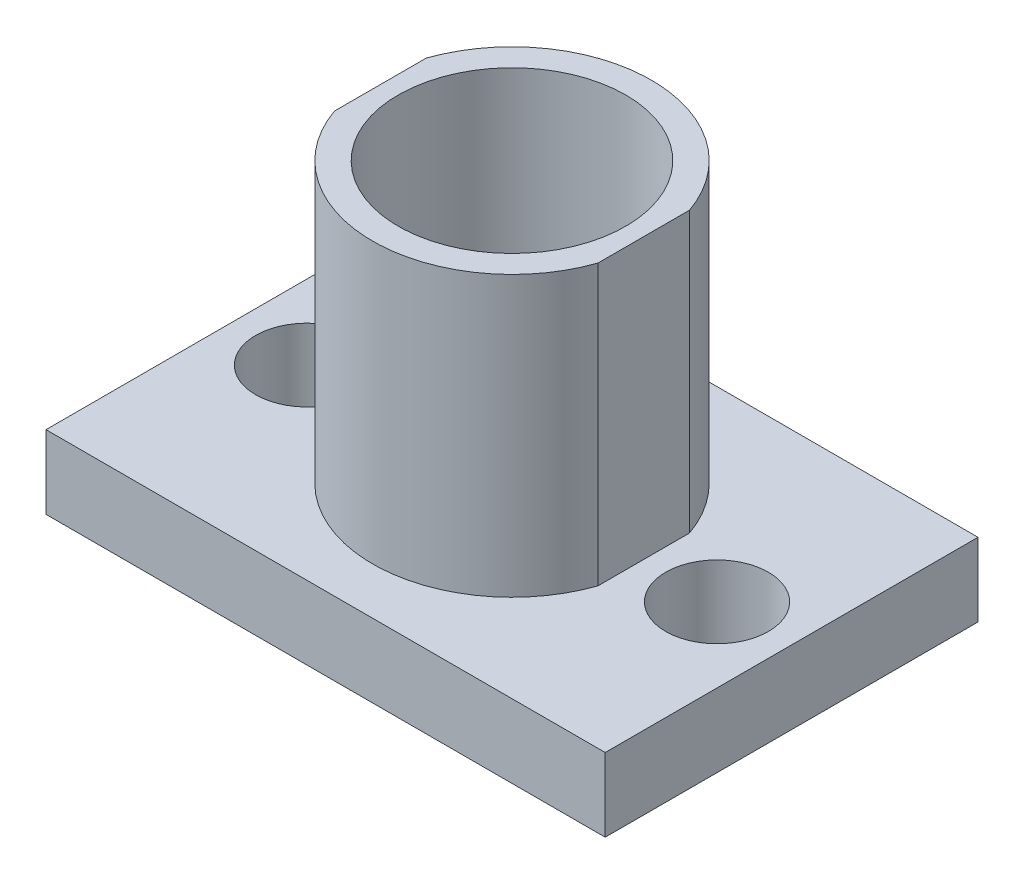
ISO-10303-21;
HEADER;
FILE_DESCRIPTION(('STEP AP214'),'2;1');
FILE_NAME('part.step','',(''),(''),'','','');
FILE_SCHEMA(('AUTOMOTIVE_DESIGN { 1 0 10303 214 1 1 1 1 }'));
ENDSEC;
DATA;
#1=APPLICATION_CONTEXT('core data for automotive mechanical design processes');
#2=APPLICATION_PROTOCOL_DEFINITION('international standard','automotive_design',2000,#1);
#3=PRODUCT_CONTEXT('',#1,'mechanical');
#4=PRODUCT('Part','Part','',(#3));
#5=PRODUCT_RELATED_PRODUCT_CATEGORY('part','',(#4));
#6=PRODUCT_DEFINITION_FORMATION('','',#4);
#7=PRODUCT_DEFINITION_CONTEXT('part definition',#1,'design');
#8=PRODUCT_DEFINITION('design','',#6,#7);
#9=PRODUCT_DEFINITION_SHAPE('','',#8);
#10=(LENGTH_UNIT() NAMED_UNIT(*) SI_UNIT(.MILLI.,.METRE.));
#11=(NAMED_UNIT(*) PLANE_ANGLE_UNIT() SI_UNIT($,.RADIAN.));
#12=(NAMED_UNIT(*) SI_UNIT($,.STERADIAN.) SOLID_ANGLE_UNIT());
#13=UNCERTAINTY_MEASURE_WITH_UNIT(LENGTH_MEASURE(1.E-05),#10,'distance_accuracy_value','');
#14=(GEOMETRIC_REPRESENTATION_CONTEXT(3) GLOBAL_UNCERTAINTY_ASSIGNED_CONTEXT((#13)) GLOBAL_UNIT_ASSIGNED_CONTEXT((#10,
#11,#12)) REPRESENTATION_CONTEXT('',''));
#15=CARTESIAN_POINT('',(0.,0.,0.));
#16=DIRECTION('',(0.,0.,1.));
#17=DIRECTION('',(1.,0.,0.));
#18=AXIS2_PLACEMENT_3D('',#15,#16,#17);
#19=CARTESIAN_POINT('',(-6.79173913043476,24.05,0.));
#20=DIRECTION('',(0.,1.,0.));
#21=DIRECTION('',(0.,0.,1.));
#22=AXIS2_PLACEMENT_3D('',#19,#20,#21);
#23=PLANE('',#22);
#24=CARTESIAN_POINT('',(-6.79173913043476,24.05,0.));
#25=DIRECTION('',(0.,1.,0.));
#26=DIRECTION('',(0.,0.,1.));
#27=AXIS2_PLACEMENT_3D('',#24,#25,#26);
#28=CIRCLE('',#27,7.75);
#29=CARTESIAN_POINT('',(-6.79173913043476,24.05,-7.75000000000001));
#30=VERTEX_POINT('',#29);
#31=EDGE_CURVE('E114',#30,#30,#28,.T.);
#32=ORIENTED_EDGE('',*,*,#31,.F.);
#33=EDGE_LOOP('',(#32));
#34=FACE_BOUND('',#33,.T.);
#35=CARTESIAN_POINT('',(-6.79173913043476,24.05,0.));
#36=DIRECTION('',(0.,1.,0.));
#37=DIRECTION('',(0.,0.,1.));
#38=AXIS2_PLACEMENT_3D('',#35,#36,#37);
#39=CIRCLE('',#38,9.5);
#40=CARTESIAN_POINT('',(-15.7636390866643,24.05,3.12330132638668));
#41=VERTEX_POINT('',#40);
#42=CARTESIAN_POINT('',(2.18016082579476,24.05,3.12330132638668));
#43=VERTEX_POINT('',#42);
#44=EDGE_CURVE('E121',#41,#43,#39,.T.);
#45=ORIENTED_EDGE('',*,*,#44,.T.);
#46=DIRECTION('',(0.,0.,1.));
#47=VECTOR('',#46,1.);
#48=CARTESIAN_POINT('',(2.18016082579476,24.05,-4.58491871763123));
#49=LINE('',#48,#47);
#50=CARTESIAN_POINT('',(2.18016082579476,24.05,-3.12330132638669));
#51=VERTEX_POINT('',#50);
#52=EDGE_CURVE('E104',#51,#43,#49,.T.);
#53=ORIENTED_EDGE('',*,*,#52,.F.);
#54=CARTESIAN_POINT('',(-15.7636390866643,24.05,-3.12330132638669));
#55=VERTEX_POINT('',#54);
#56=EDGE_CURVE('E108',#51,#55,#39,.T.);
#57=ORIENTED_EDGE('',*,*,#56,.T.);
#58=DIRECTION('',(0.,0.,-1.));
#59=VECTOR('',#58,1.);
#60=CARTESIAN_POINT('',(-15.7636390866643,24.05,-4.58491871763123));
#61=LINE('',#60,#59);
#62=EDGE_CURVE('E159',#41,#55,#61,.T.);
#63=ORIENTED_EDGE('',*,*,#62,.F.);
#64=EDGE_LOOP('',(#45,#53,#57,#63));
#65=FACE_BOUND('',#64,.T.);
#66=ADVANCED_FACE('F33',(#34,#65),#23,.T.);
#67=CARTESIAN_POINT('',(-6.79173913043476,24.05,0.));
#68=DIRECTION('',(0.,-1.,0.));
#69=DIRECTION('',(0.,0.,-1.));
#70=AXIS2_PLACEMENT_3D('',#67,#68,#69);
#71=CYLINDRICAL_SURFACE('',#70,9.5);
#72=DIRECTION('',(0.,-1.,0.));
#73=VECTOR('',#72,1.);
#74=CARTESIAN_POINT('',(2.18016082579476,24.05,3.12330132638668));
#75=LINE('',#74,#73);
#76=CARTESIAN_POINT('',(2.18016082579476,5.,3.12330132638668));
#77=VERTEX_POINT('',#76);
#78=EDGE_CURVE('E102',#43,#77,#75,.T.);
#79=ORIENTED_EDGE('',*,*,#78,.F.);
#80=ORIENTED_EDGE('',*,*,#44,.F.);
#81=DIRECTION('',(0.,-1.,0.));
#82=VECTOR('',#81,1.);
#83=CARTESIAN_POINT('',(-15.7636390866643,24.05,3.12330132638668));
#84=LINE('',#83,#82);
#85=CARTESIAN_POINT('',(-15.7636390866643,5.,3.12330132638668));
#86=VERTEX_POINT('',#85);
#87=EDGE_CURVE('E41',#86,#41,#84,.F.);
#88=ORIENTED_EDGE('',*,*,#87,.F.);
#89=CARTESIAN_POINT('',(-6.79173913043476,5.,0.));
#90=DIRECTION('',(0.,1.,0.));
#91=DIRECTION('',(0.,0.,1.));
#92=AXIS2_PLACEMENT_3D('',#89,#90,#91);
#93=CIRCLE('',#92,9.5);
#94=EDGE_CURVE('E113',#86,#77,#93,.T.);
#95=ORIENTED_EDGE('',*,*,#94,.T.);
#96=EDGE_LOOP('',(#79,#80,#88,#95));
#97=FACE_BOUND('',#96,.T.);
#98=ADVANCED_FACE('F166',(#97),#71,.T.);
#99=DIRECTION('',(0.,-1.,0.));
#100=VECTOR('',#99,1.);
#101=CARTESIAN_POINT('',(2.18016082579476,24.05,-3.1233013263867));
#102=LINE('',#101,#100);
#103=CARTESIAN_POINT('',(2.18016082579476,5.,-3.12330132638669));
#104=VERTEX_POINT('',#103);
#105=EDGE_CURVE('E99',#104,#51,#102,.F.);
#106=ORIENTED_EDGE('',*,*,#105,.F.);
#107=CARTESIAN_POINT('',(-15.7636390866643,5.,-3.12330132638669));
#108=VERTEX_POINT('',#107);
#109=EDGE_CURVE('E55',#104,#108,#93,.T.);
#110=ORIENTED_EDGE('',*,*,#109,.T.);
#111=DIRECTION('',(0.,-1.,0.));
#112=VECTOR('',#111,1.);
#113=CARTESIAN_POINT('',(-15.7636390866643,24.05,-3.1233013263867));
#114=LINE('',#113,#112);
#115=EDGE_CURVE('E11',#55,#108,#114,.T.);
#116=ORIENTED_EDGE('',*,*,#115,.F.);
#117=ORIENTED_EDGE('',*,*,#56,.F.);
#118=EDGE_LOOP('',(#106,#110,#116,#117));
#119=FACE_BOUND('',#118,.T.);
#120=ADVANCED_FACE('F107',(#119),#71,.T.);
#121=CARTESIAN_POINT('',(0.,5.,0.));
#122=DIRECTION('',(0.,1.,0.));
#123=DIRECTION('',(0.,0.,1.));
#124=AXIS2_PLACEMENT_3D('',#121,#122,#123);
#125=PLANE('',#124);
#126=CARTESIAN_POINT('',(7.17826086956524,5.,0.));
#127=DIRECTION('',(0.,1.,0.));
#128=DIRECTION('',(0.,0.,1.));
#129=AXIS2_PLACEMENT_3D('',#126,#127,#128);
#130=CIRCLE('',#129,3.5);
#131=CARTESIAN_POINT('',(7.17826086956524,5.,3.5));
#132=VERTEX_POINT('',#131);
#133=EDGE_CURVE('E173',#132,#132,#130,.T.);
#134=ORIENTED_EDGE('',*,*,#133,.F.);
#135=EDGE_LOOP('',(#134));
#136=FACE_BOUND('',#135,.T.);
#137=ORIENTED_EDGE('',*,*,#109,.F.);
#138=DIRECTION('',(0.,0.,1.));
#139=VECTOR('',#138,1.);
#140=CARTESIAN_POINT('',(2.18016082579476,5.,-4.58491871763123));
#141=LINE('',#140,#139);
#142=EDGE_CURVE('E48',#104,#77,#141,.T.);
#143=ORIENTED_EDGE('',*,*,#142,.T.);
#144=ORIENTED_EDGE('',*,*,#94,.F.);
#145=DIRECTION('',(0.,0.,-1.));
#146=VECTOR('',#145,1.);
#147=CARTESIAN_POINT('',(-15.7636390866643,5.,-4.58491871763123));
#148=LINE('',#147,#146);
#149=EDGE_CURVE('E112',#86,#108,#148,.T.);
#150=ORIENTED_EDGE('',*,*,#149,.T.);
#151=EDGE_LOOP('',(#137,#143,#144,#150));
#152=FACE_BOUND('',#151,.T.);
#153=DIRECTION('',(0.,0.,1.));
#154=VECTOR('',#153,1.);
#155=CARTESIAN_POINT('',(-25.8417391304348,5.,-12.7));
#156=LINE('',#155,#154);
#157=CARTESIAN_POINT('',(-25.8417391304348,5.,-12.7));
#158=VERTEX_POINT('',#157);
#159=CARTESIAN_POINT('',(-25.8417391304348,5.,12.7));
#160=VERTEX_POINT('',#159);
#161=EDGE_CURVE('E122',#158,#160,#156,.T.);
#162=ORIENTED_EDGE('',*,*,#161,.T.);
#163=DIRECTION('',(1.,0.,0.));
#164=VECTOR('',#163,1.);
#165=CARTESIAN_POINT('',(-25.8417391304348,5.,12.7));
#166=LINE('',#165,#164);
#167=CARTESIAN_POINT('',(12.2582608695652,5.,12.7));
#168=VERTEX_POINT('',#167);
#169=EDGE_CURVE('E125',#160,#168,#166,.T.);
#170=ORIENTED_EDGE('',*,*,#169,.T.);
#171=DIRECTION('',(0.,0.,-1.));
#172=VECTOR('',#171,1.);
#173=CARTESIAN_POINT('',(12.2582608695652,5.,-12.7));
#174=LINE('',#173,#172);
#175=CARTESIAN_POINT('',(12.2582608695652,5.,-12.7));
#176=VERTEX_POINT('',#175);
#177=EDGE_CURVE('E128',#168,#176,#174,.T.);
#178=ORIENTED_EDGE('',*,*,#177,.T.);
#179=DIRECTION('',(-1.,0.,0.));
#180=VECTOR('',#179,1.);
#181=CARTESIAN_POINT('',(-25.8417391304348,5.,-12.7));
#182=LINE('',#181,#180);
#183=EDGE_CURVE('E130',#176,#158,#182,.T.);
#184=ORIENTED_EDGE('',*,*,#183,.T.);
#185=EDGE_LOOP('',(#162,#170,#178,#184));
#186=FACE_BOUND('',#185,.T.);
#187=CARTESIAN_POINT('',(-20.7617391304348,5.,0.));
#188=DIRECTION('',(0.,1.,0.));
#189=DIRECTION('',(0.,0.,1.));
#190=AXIS2_PLACEMENT_3D('',#187,#188,#189);
#191=CIRCLE('',#190,3.5);
#192=CARTESIAN_POINT('',(-20.7617391304348,5.,3.5));
#193=VERTEX_POINT('',#192);
#194=EDGE_CURVE('E164',#193,#193,#191,.T.);
#195=ORIENTED_EDGE('',*,*,#194,.F.);
#196=EDGE_LOOP('',(#195));
#197=FACE_BOUND('',#196,.T.);
#198=ADVANCED_FACE('F110',(#136,#152,#186,#197),#125,.T.);
#199=CARTESIAN_POINT('',(-25.8417391304348,5.,-12.7));
#200=DIRECTION('',(1.,0.,0.));
#201=DIRECTION('',(0.,0.,-1.));
#202=AXIS2_PLACEMENT_3D('',#199,#200,#201);
#203=PLANE('',#202);
#204=DIRECTION('',(0.,0.,1.));
#205=VECTOR('',#204,1.);
#206=CARTESIAN_POINT('',(-25.8417391304348,0.,-12.7));
#207=LINE('',#206,#205);
#208=CARTESIAN_POINT('',(-25.8417391304348,0.,-12.7));
#209=VERTEX_POINT('',#208);
#210=CARTESIAN_POINT('',(-25.8417391304348,0.,12.7));
#211=VERTEX_POINT('',#210);
#212=EDGE_CURVE('E133',#209,#211,#207,.T.);
#213=ORIENTED_EDGE('',*,*,#212,.T.);
#214=DIRECTION('',(0.,-1.,0.));
#215=VECTOR('',#214,1.);
#216=CARTESIAN_POINT('',(-25.8417391304348,5.,12.7));
#217=LINE('',#216,#215);
#218=EDGE_CURVE('E149',#160,#211,#217,.T.);
#219=ORIENTED_EDGE('',*,*,#218,.F.);
#220=ORIENTED_EDGE('',*,*,#161,.F.);
#221=DIRECTION('',(0.,-1.,0.));
#222=VECTOR('',#221,1.);
#223=CARTESIAN_POINT('',(-25.8417391304348,5.,-12.7));
#224=LINE('',#223,#222);
#225=EDGE_CURVE('E132',#158,#209,#224,.T.);
#226=ORIENTED_EDGE('',*,*,#225,.T.);
#227=EDGE_LOOP('',(#213,#219,#220,#226));
#228=FACE_BOUND('',#227,.T.);
#229=ADVANCED_FACE('F35',(#228),#203,.F.);
#230=CARTESIAN_POINT('',(-25.8417391304348,5.,12.7));
#231=DIRECTION('',(0.,0.,-1.));
#232=DIRECTION('',(-1.,0.,0.));
#233=AXIS2_PLACEMENT_3D('',#230,#231,#232);
#234=PLANE('',#233);
#235=DIRECTION('',(1.,0.,0.));
#236=VECTOR('',#235,1.);
#237=CARTESIAN_POINT('',(-25.8417391304348,0.,12.7));
#238=LINE('',#237,#236);
#239=CARTESIAN_POINT('',(12.2582608695652,0.,12.7));
#240=VERTEX_POINT('',#239);
#241=EDGE_CURVE('E136',#211,#240,#238,.T.);
#242=ORIENTED_EDGE('',*,*,#241,.T.);
#243=DIRECTION('',(0.,-1.,0.));
#244=VECTOR('',#243,1.);
#245=CARTESIAN_POINT('',(12.2582608695652,5.,12.7));
#246=LINE('',#245,#244);
#247=EDGE_CURVE('E146',#168,#240,#246,.T.);
#248=ORIENTED_EDGE('',*,*,#247,.F.);
#249=ORIENTED_EDGE('',*,*,#169,.F.);
#250=ORIENTED_EDGE('',*,*,#218,.T.);
#251=EDGE_LOOP('',(#242,#248,#249,#250));
#252=FACE_BOUND('',#251,.T.);
#253=ADVANCED_FACE('F190',(#252),#234,.F.);
#254=CARTESIAN_POINT('',(12.2582608695652,5.,-12.7));
#255=DIRECTION('',(-1.,0.,0.));
#256=DIRECTION('',(0.,0.,1.));
#257=AXIS2_PLACEMENT_3D('',#254,#255,#256);
#258=PLANE('',#257);
#259=DIRECTION('',(0.,0.,-1.));
#260=VECTOR('',#259,1.);
#261=CARTESIAN_POINT('',(12.2582608695652,0.,-12.7));
#262=LINE('',#261,#260);
#263=CARTESIAN_POINT('',(12.2582608695652,0.,-12.7));
#264=VERTEX_POINT('',#263);
#265=EDGE_CURVE('E138',#240,#264,#262,.T.);
#266=ORIENTED_EDGE('',*,*,#265,.T.);
#267=DIRECTION('',(0.,-1.,0.));
#268=VECTOR('',#267,1.);
#269=CARTESIAN_POINT('',(12.2582608695652,5.,-12.7));
#270=LINE('',#269,#268);
#271=EDGE_CURVE('E143',#176,#264,#270,.T.);
#272=ORIENTED_EDGE('',*,*,#271,.F.);
#273=ORIENTED_EDGE('',*,*,#177,.F.);
#274=ORIENTED_EDGE('',*,*,#247,.T.);
#275=EDGE_LOOP('',(#266,#272,#273,#274));
#276=FACE_BOUND('',#275,.T.);
#277=ADVANCED_FACE('F254',(#276),#258,.F.);
#278=CARTESIAN_POINT('',(-25.8417391304348,5.,-12.7));
#279=DIRECTION('',(0.,0.,1.));
#280=DIRECTION('',(1.,0.,0.));
#281=AXIS2_PLACEMENT_3D('',#278,#279,#280);
#282=PLANE('',#281);
#283=DIRECTION('',(-1.,0.,0.));
#284=VECTOR('',#283,1.);
#285=CARTESIAN_POINT('',(-25.8417391304348,0.,-12.7));
#286=LINE('',#285,#284);
#287=EDGE_CURVE('E126',#264,#209,#286,.T.);
#288=ORIENTED_EDGE('',*,*,#287,.T.);
#289=ORIENTED_EDGE('',*,*,#225,.F.);
#290=ORIENTED_EDGE('',*,*,#183,.F.);
#291=ORIENTED_EDGE('',*,*,#271,.T.);
#292=EDGE_LOOP('',(#288,#289,#290,#291));
#293=FACE_BOUND('',#292,.T.);
#294=ADVANCED_FACE('F248',(#293),#282,.F.);
#295=CARTESIAN_POINT('',(0.,0.,0.));
#296=DIRECTION('',(0.,1.,0.));
#297=DIRECTION('',(0.,0.,1.));
#298=AXIS2_PLACEMENT_3D('',#295,#296,#297);
#299=PLANE('',#298);
#300=CARTESIAN_POINT('',(-20.7617391304348,0.,0.));
#301=DIRECTION('',(0.,1.,0.));
#302=DIRECTION('',(0.,0.,1.));
#303=AXIS2_PLACEMENT_3D('',#300,#301,#302);
#304=CIRCLE('',#303,3.5);
#305=CARTESIAN_POINT('',(-20.7617391304348,0.,3.5));
#306=VERTEX_POINT('',#305);
#307=EDGE_CURVE('E170',#306,#306,#304,.T.);
#308=ORIENTED_EDGE('',*,*,#307,.T.);
#309=EDGE_LOOP('',(#308));
#310=FACE_BOUND('',#309,.T.);
#311=CARTESIAN_POINT('',(7.17826086956524,0.,0.));
#312=DIRECTION('',(0.,1.,0.));
#313=DIRECTION('',(0.,0.,1.));
#314=AXIS2_PLACEMENT_3D('',#311,#312,#313);
#315=CIRCLE('',#314,3.5);
#316=CARTESIAN_POINT('',(7.17826086956524,0.,3.5));
#317=VERTEX_POINT('',#316);
#318=EDGE_CURVE('E117',#317,#317,#315,.T.);
#319=ORIENTED_EDGE('',*,*,#318,.T.);
#320=EDGE_LOOP('',(#319));
#321=FACE_BOUND('',#320,.T.);
#322=ORIENTED_EDGE('',*,*,#212,.F.);
#323=ORIENTED_EDGE('',*,*,#287,.F.);
#324=ORIENTED_EDGE('',*,*,#265,.F.);
#325=ORIENTED_EDGE('',*,*,#241,.F.);
#326=EDGE_LOOP('',(#322,#323,#324,#325));
#327=FACE_BOUND('',#326,.T.);
#328=ADVANCED_FACE('F207',(#310,#321,#327),#299,.F.);
#329=CARTESIAN_POINT('',(-6.79173913043476,24.05,0.));
#330=DIRECTION('',(0.,-1.,0.));
#331=DIRECTION('',(0.,0.,-1.));
#332=AXIS2_PLACEMENT_3D('',#329,#330,#331);
#333=CYLINDRICAL_SURFACE('',#332,7.75);
#334=CARTESIAN_POINT('',(-6.79173913043476,5.,0.));
#335=DIRECTION('',(0.,1.,0.));
#336=DIRECTION('',(0.,0.,1.));
#337=AXIS2_PLACEMENT_3D('',#334,#335,#336);
#338=CIRCLE('',#337,7.75);
#339=CARTESIAN_POINT('',(-6.79173913043476,5.,-7.75000000000001));
#340=VERTEX_POINT('',#339);
#341=EDGE_CURVE('E152',#340,#340,#338,.F.);
#342=CARTESIAN_POINT('',(-6.79173913043476,24.05,-7.75000000000001));
#343=CARTESIAN_POINT('',(-6.79173913043476,23.8515625,-7.75000000000001));
#344=CARTESIAN_POINT('',(-6.79173913043476,23.653125,-7.75000000000001));
#345=CARTESIAN_POINT('',(-6.79173913043476,23.25625,-7.75000000000001));
#346=CARTESIAN_POINT('',(-6.79173913043476,23.0578125,-7.75000000000001));
#347=CARTESIAN_POINT('',(-6.79173913043476,22.6609375,-7.75000000000001));
#348=CARTESIAN_POINT('',(-6.79173913043476,22.4625,-7.75000000000001));
#349=CARTESIAN_POINT('',(-6.79173913043476,22.065625,-7.75000000000001));
#350=CARTESIAN_POINT('',(-6.79173913043476,21.8671875,-7.75000000000001));
#351=CARTESIAN_POINT('',(-6.79173913043476,21.4703125,-7.75000000000001));
#352=CARTESIAN_POINT('',(-6.79173913043476,21.271875,-7.75000000000001));
#353=CARTESIAN_POINT('',(-6.79173913043476,20.875,-7.75000000000001));
#354=CARTESIAN_POINT('',(-6.79173913043476,20.6765625,-7.75000000000001));
#355=CARTESIAN_POINT('',(-6.79173913043476,20.2796875,-7.75000000000001));
#356=CARTESIAN_POINT('',(-6.79173913043476,20.08125,-7.75000000000001));
#357=CARTESIAN_POINT('',(-6.79173913043476,19.684375,-7.75000000000001));
#358=CARTESIAN_POINT('',(-6.79173913043476,19.4859375,-7.75000000000001));
#359=CARTESIAN_POINT('',(-6.79173913043476,19.0890625,-7.75000000000001));
#360=CARTESIAN_POINT('',(-6.79173913043476,18.890625,-7.75000000000001));
#361=CARTESIAN_POINT('',(-6.79173913043476,18.49375,-7.75000000000001));
#362=CARTESIAN_POINT('',(-6.79173913043476,18.2953125,-7.75000000000001));
#363=CARTESIAN_POINT('',(-6.79173913043476,17.8984375,-7.75000000000001));
#364=CARTESIAN_POINT('',(-6.79173913043476,17.7,-7.75000000000001));
#365=CARTESIAN_POINT('',(-6.79173913043476,17.303125,-7.75000000000001));
#366=CARTESIAN_POINT('',(-6.79173913043476,17.1046875,-7.75000000000001));
#367=CARTESIAN_POINT('',(-6.79173913043476,16.7078125,-7.75000000000001));
#368=CARTESIAN_POINT('',(-6.79173913043476,16.509375,-7.75000000000001));
#369=CARTESIAN_POINT('',(-6.79173913043476,16.1125,-7.75000000000001));
#370=CARTESIAN_POINT('',(-6.79173913043476,15.9140625,-7.75000000000001));
#371=CARTESIAN_POINT('',(-6.79173913043476,15.5171875,-7.75000000000001));
#372=CARTESIAN_POINT('',(-6.79173913043476,15.31875,-7.75000000000001));
#373=CARTESIAN_POINT('',(-6.79173913043476,14.921875,-7.75000000000001));
#374=CARTESIAN_POINT('',(-6.79173913043476,14.7234375,-7.75000000000001));
#375=CARTESIAN_POINT('',(-6.79173913043476,14.3265625,-7.75000000000001));
#376=CARTESIAN_POINT('',(-6.79173913043476,14.128125,-7.75000000000001));
#377=CARTESIAN_POINT('',(-6.79173913043476,13.73125,-7.75000000000001));
#378=CARTESIAN_POINT('',(-6.79173913043476,13.5328125,-7.75000000000001));
#379=CARTESIAN_POINT('',(-6.79173913043476,13.1359375,-7.75000000000001));
#380=CARTESIAN_POINT('',(-6.79173913043476,12.9375,-7.75000000000001));
#381=CARTESIAN_POINT('',(-6.79173913043476,12.540625,-7.75000000000001));
#382=CARTESIAN_POINT('',(-6.79173913043476,12.3421875,-7.75000000000001));
#383=CARTESIAN_POINT('',(-6.79173913043476,11.9453125,-7.75000000000001));
#384=CARTESIAN_POINT('',(-6.79173913043476,11.746875,-7.75000000000001));
#385=CARTESIAN_POINT('',(-6.79173913043476,11.35,-7.75000000000001));
#386=CARTESIAN_POINT('',(-6.79173913043476,11.1515625,-7.75000000000001));
#387=CARTESIAN_POINT('',(-6.79173913043476,10.7546875,-7.75000000000001));
#388=CARTESIAN_POINT('',(-6.79173913043476,10.55625,-7.75000000000001));
#389=CARTESIAN_POINT('',(-6.79173913043476,10.159375,-7.75000000000001));
#390=CARTESIAN_POINT('',(-6.79173913043476,9.9609375,-7.75000000000001));
#391=CARTESIAN_POINT('',(-6.79173913043476,9.5640625,-7.75000000000001));
#392=CARTESIAN_POINT('',(-6.79173913043476,9.365625,-7.75000000000001));
#393=CARTESIAN_POINT('',(-6.79173913043476,8.96875,-7.75000000000001));
#394=CARTESIAN_POINT('',(-6.79173913043476,8.7703125,-7.75000000000001));
#395=CARTESIAN_POINT('',(-6.79173913043476,8.3734375,-7.75000000000001));
#396=CARTESIAN_POINT('',(-6.79173913043476,8.175,-7.75000000000001));
#397=CARTESIAN_POINT('',(-6.79173913043476,7.778125,-7.75000000000001));
#398=CARTESIAN_POINT('',(-6.79173913043476,7.5796875,-7.75000000000001));
#399=CARTESIAN_POINT('',(-6.79173913043476,7.1828125,-7.75000000000001));
#400=CARTESIAN_POINT('',(-6.79173913043476,6.984375,-7.75000000000001));
#401=CARTESIAN_POINT('',(-6.79173913043476,6.5875,-7.75000000000001));
#402=CARTESIAN_POINT('',(-6.79173913043476,6.3890625,-7.75000000000001));
#403=CARTESIAN_POINT('',(-6.79173913043476,5.9921875,-7.75000000000001));
#404=CARTESIAN_POINT('',(-6.79173913043476,5.79375,-7.75000000000001));
#405=CARTESIAN_POINT('',(-6.79173913043476,5.396875,-7.75000000000001));
#406=CARTESIAN_POINT('',(-6.79173913043476,5.1984375,-7.75000000000001));
#407=CARTESIAN_POINT('',(-6.79173913043476,5.,-7.75000000000001));
#408=B_SPLINE_CURVE_WITH_KNOTS('',3,(#342,#343,#344,#345,#346,#347,#348,#349,#350,#351,#352,
#353,#354,#355,#356,#357,#358,#359,#360,#361,#362,#363,#364,#365,#366,#367,#368,#369,#370,#371,
#372,#373,#374,#375,#376,#377,#378,#379,#380,#381,#382,#383,#384,#385,#386,#387,#388,#389,#390,
#391,#392,#393,#394,#395,#396,#397,#398,#399,#400,#401,#402,#403,#404,#405,#406,#407),
.UNSPECIFIED.,.F.,.F.,(4,2,2,2,2,2,2,2,2,2,2,2,2,2,2,2,2,2,2,2,2,2,2,2,2,2,2,2,2,2,2,2,4),(0.,
0.5953125,1.190625,1.7859375,2.38125,2.9765625,3.571875,4.1671875,4.7625,5.3578125,5.953125,
6.5484375,7.14375,7.7390625,8.334375,8.9296875,9.525,10.1203125,10.715625,11.3109375,11.90625,
12.5015625,13.096875,13.6921875,14.2875,14.8828125,15.478125,16.0734375,16.66875,17.2640625,
17.859375,18.4546875,19.05),.UNSPECIFIED.);
#409=EDGE_CURVE('BSEAM195',#30,#340,#408,.T.);
#410=ORIENTED_EDGE('',*,*,#31,.T.);
#411=ORIENTED_EDGE('',*,*,#341,.T.);
#412=ORIENTED_EDGE('',*,*,#409,.T.);
#413=ORIENTED_EDGE('',*,*,#409,.F.);
#414=EDGE_LOOP('',(#410,#412,#411,#413));
#415=FACE_BOUND('',#414,.T.);
#416=ADVANCED_FACE('F195',(#415),#333,.F.);
#417=ORIENTED_EDGE('',*,*,#341,.F.);
#418=EDGE_LOOP('',(#417));
#419=FACE_BOUND('',#418,.T.);
#420=ADVANCED_FACE('F185',(#419),#125,.T.);
#421=CARTESIAN_POINT('',(7.17826086956524,0.,0.));
#422=DIRECTION('',(0.,1.,0.));
#423=DIRECTION('',(0.,0.,1.));
#424=AXIS2_PLACEMENT_3D('',#421,#422,#423);
#425=CYLINDRICAL_SURFACE('',#424,3.5);
#426=ORIENTED_EDGE('',*,*,#318,.F.);
#427=EDGE_LOOP('',(#426));
#428=FACE_BOUND('',#427,.T.);
#429=ORIENTED_EDGE('',*,*,#133,.T.);
#430=EDGE_LOOP('',(#429));
#431=FACE_BOUND('',#430,.T.);
#432=ADVANCED_FACE('F181',(#428,#431),#425,.F.);
#433=CARTESIAN_POINT('',(-20.7617391304348,0.,0.));
#434=DIRECTION('',(0.,1.,0.));
#435=DIRECTION('',(0.,0.,1.));
#436=AXIS2_PLACEMENT_3D('',#433,#434,#435);
#437=CYLINDRICAL_SURFACE('',#436,3.5);
#438=ORIENTED_EDGE('',*,*,#307,.F.);
#439=EDGE_LOOP('',(#438));
#440=FACE_BOUND('',#439,.T.);
#441=ORIENTED_EDGE('',*,*,#194,.T.);
#442=EDGE_LOOP('',(#441));
#443=FACE_BOUND('',#442,.T.);
#444=ADVANCED_FACE('F211',(#440,#443),#437,.F.);
#445=CARTESIAN_POINT('',(-15.7636390866643,24.05,-4.58491871763123));
#446=DIRECTION('',(-1.,0.,0.));
#447=DIRECTION('',(0.,0.,1.));
#448=AXIS2_PLACEMENT_3D('',#445,#446,#447);
#449=PLANE('',#448);
#450=ORIENTED_EDGE('',*,*,#115,.T.);
#451=ORIENTED_EDGE('',*,*,#149,.F.);
#452=ORIENTED_EDGE('',*,*,#87,.T.);
#453=ORIENTED_EDGE('',*,*,#62,.T.);
#454=EDGE_LOOP('',(#450,#451,#452,#453));
#455=FACE_BOUND('',#454,.T.);
#456=ADVANCED_FACE('F158',(#455),#449,.T.);
#457=CARTESIAN_POINT('',(2.18016082579476,24.05,-4.58491871763123));
#458=DIRECTION('',(1.,0.,0.));
#459=DIRECTION('',(0.,0.,-1.));
#460=AXIS2_PLACEMENT_3D('',#457,#458,#459);
#461=PLANE('',#460);
#462=ORIENTED_EDGE('',*,*,#78,.T.);
#463=ORIENTED_EDGE('',*,*,#142,.F.);
#464=ORIENTED_EDGE('',*,*,#105,.T.);
#465=ORIENTED_EDGE('',*,*,#52,.T.);
#466=EDGE_LOOP('',(#462,#463,#464,#465));
#467=FACE_BOUND('',#466,.T.);
#468=ADVANCED_FACE('F98',(#467),#461,.T.);
#469=CLOSED_SHELL('',(#66,#98,#120,#198,#229,#253,#277,#294,#328,#416,#420,#432,#444,#456,#468));
#470=MANIFOLD_SOLID_BREP('B2',#469);
#471=ADVANCED_BREP_SHAPE_REPRESENTATION('',(#18,#470),#14);
#472=SHAPE_DEFINITION_REPRESENTATION(#9,#471);
ENDSEC;
END-ISO-10303-21;
